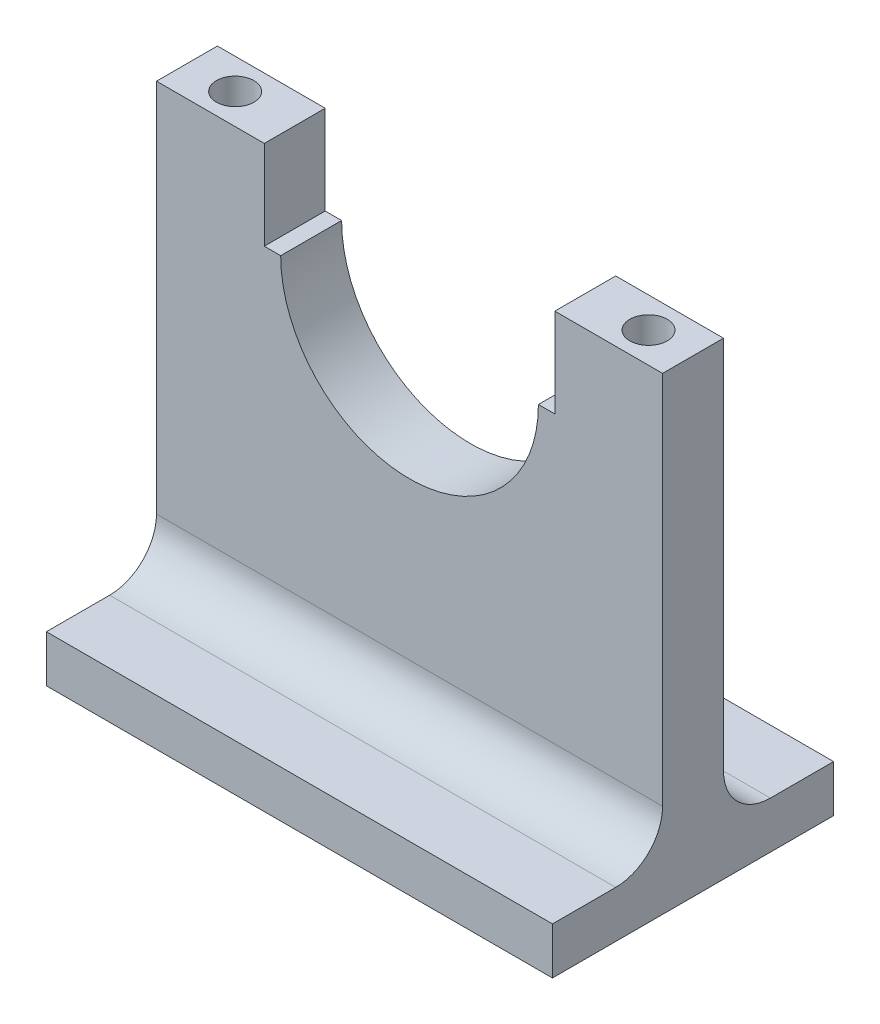
ISO-10303-21;
HEADER;
FILE_DESCRIPTION(('STEP AP214'),'2;1');
FILE_NAME('part.step','',(''),(''),'','','');
FILE_SCHEMA(('AUTOMOTIVE_DESIGN { 1 0 10303 214 1 1 1 1 }'));
ENDSEC;
DATA;
#1=APPLICATION_CONTEXT('core data for automotive mechanical design processes');
#2=APPLICATION_PROTOCOL_DEFINITION('international standard','automotive_design',2000,#1);
#3=PRODUCT_CONTEXT('',#1,'mechanical');
#4=PRODUCT('Part','Part','',(#3));
#5=PRODUCT_RELATED_PRODUCT_CATEGORY('part','',(#4));
#6=PRODUCT_DEFINITION_FORMATION('','',#4);
#7=PRODUCT_DEFINITION_CONTEXT('part definition',#1,'design');
#8=PRODUCT_DEFINITION('design','',#6,#7);
#9=PRODUCT_DEFINITION_SHAPE('','',#8);
#10=(LENGTH_UNIT() NAMED_UNIT(*) SI_UNIT(.MILLI.,.METRE.));
#11=(NAMED_UNIT(*) PLANE_ANGLE_UNIT() SI_UNIT($,.RADIAN.));
#12=(NAMED_UNIT(*) SI_UNIT($,.STERADIAN.) SOLID_ANGLE_UNIT());
#13=UNCERTAINTY_MEASURE_WITH_UNIT(LENGTH_MEASURE(1.E-05),#10,'distance_accuracy_value','');
#14=(GEOMETRIC_REPRESENTATION_CONTEXT(3) GLOBAL_UNCERTAINTY_ASSIGNED_CONTEXT((#13)) GLOBAL_UNIT_ASSIGNED_CONTEXT((#10,
#11,#12)) REPRESENTATION_CONTEXT('',''));
#15=CARTESIAN_POINT('',(0.,0.,0.));
#16=DIRECTION('',(0.,0.,1.));
#17=DIRECTION('',(1.,0.,0.));
#18=AXIS2_PLACEMENT_3D('',#15,#16,#17);
#19=CARTESIAN_POINT('',(-54.,5.,30.));
#20=DIRECTION('',(0.,-1.,0.));
#21=DIRECTION('',(0.,0.,-1.));
#22=AXIS2_PLACEMENT_3D('',#19,#20,#21);
#23=PLANE('',#22);
#24=DIRECTION('',(0.,0.,-1.));
#25=VECTOR('',#24,1.);
#26=CARTESIAN_POINT('',(54.,5.,30.));
#27=LINE('',#26,#25);
#28=CARTESIAN_POINT('',(54.,5.,30.));
#29=VERTEX_POINT('',#28);
#30=CARTESIAN_POINT('',(54.,5.,16.5));
#31=VERTEX_POINT('',#30);
#32=EDGE_CURVE('E258',#29,#31,#27,.T.);
#33=ORIENTED_EDGE('',*,*,#32,.T.);
#34=DIRECTION('',(1.,0.,0.));
#35=VECTOR('',#34,1.);
#36=CARTESIAN_POINT('',(-54.,5.,16.5));
#37=LINE('',#36,#35);
#38=CARTESIAN_POINT('',(-54.,5.,16.5));
#39=VERTEX_POINT('',#38);
#40=EDGE_CURVE('E262',#31,#39,#37,.F.);
#41=ORIENTED_EDGE('',*,*,#40,.T.);
#42=DIRECTION('',(0.,0.,-1.));
#43=VECTOR('',#42,1.);
#44=CARTESIAN_POINT('',(-54.,5.,30.));
#45=LINE('',#44,#43);
#46=CARTESIAN_POINT('',(-54.,5.,30.));
#47=VERTEX_POINT('',#46);
#48=EDGE_CURVE('E254',#47,#39,#45,.T.);
#49=ORIENTED_EDGE('',*,*,#48,.F.);
#50=DIRECTION('',(-1.,0.,0.));
#51=VECTOR('',#50,1.);
#52=CARTESIAN_POINT('',(-54.,5.,30.));
#53=LINE('',#52,#51);
#54=EDGE_CURVE('E233',#29,#47,#53,.T.);
#55=ORIENTED_EDGE('',*,*,#54,.F.);
#56=EDGE_LOOP('',(#33,#41,#49,#55));
#57=FACE_BOUND('',#56,.T.);
#58=ADVANCED_FACE('F41',(#57),#23,.F.);
#59=CARTESIAN_POINT('',(54.,-5.,30.));
#60=DIRECTION('',(-1.,0.,0.));
#61=DIRECTION('',(0.,0.,1.));
#62=AXIS2_PLACEMENT_3D('',#59,#60,#61);
#63=PLANE('',#62);
#64=DIRECTION('',(0.,1.,0.));
#65=VECTOR('',#64,1.);
#66=CARTESIAN_POINT('',(54.,-5.,-30.));
#67=LINE('',#66,#65);
#68=CARTESIAN_POINT('',(54.,-5.,-30.));
#69=VERTEX_POINT('',#68);
#70=CARTESIAN_POINT('',(54.,5.,-30.));
#71=VERTEX_POINT('',#70);
#72=EDGE_CURVE('E171',#69,#71,#67,.T.);
#73=ORIENTED_EDGE('',*,*,#72,.T.);
#74=CARTESIAN_POINT('',(54.,5.,-16.5));
#75=VERTEX_POINT('',#74);
#76=EDGE_CURVE('E257',#75,#71,#27,.T.);
#77=ORIENTED_EDGE('',*,*,#76,.F.);
#78=CARTESIAN_POINT('',(54.,15.,-16.5));
#79=DIRECTION('',(-1.,0.,0.));
#80=DIRECTION('',(0.,0.,1.));
#81=AXIS2_PLACEMENT_3D('',#78,#79,#80);
#82=CIRCLE('',#81,10.);
#83=CARTESIAN_POINT('',(54.,15.,-6.5));
#84=VERTEX_POINT('',#83);
#85=EDGE_CURVE('E49',#75,#84,#82,.T.);
#86=ORIENTED_EDGE('',*,*,#85,.T.);
#87=DIRECTION('',(0.,1.,0.));
#88=VECTOR('',#87,1.);
#89=CARTESIAN_POINT('',(54.,5.,-6.5));
#90=LINE('',#89,#88);
#91=CARTESIAN_POINT('',(54.,94.9999999999999,-6.5));
#92=VERTEX_POINT('',#91);
#93=EDGE_CURVE('E168',#84,#92,#90,.T.);
#94=ORIENTED_EDGE('',*,*,#93,.T.);
#95=DIRECTION('',(0.,0.,-1.));
#96=VECTOR('',#95,1.);
#97=CARTESIAN_POINT('',(54.,94.9999999999999,6.5));
#98=LINE('',#97,#96);
#99=CARTESIAN_POINT('',(54.,94.9999999999999,6.5));
#100=VERTEX_POINT('',#99);
#101=EDGE_CURVE('E165',#100,#92,#98,.T.);
#102=ORIENTED_EDGE('',*,*,#101,.F.);
#103=DIRECTION('',(0.,1.,0.));
#104=VECTOR('',#103,1.);
#105=CARTESIAN_POINT('',(54.,5.,6.5));
#106=LINE('',#105,#104);
#107=CARTESIAN_POINT('',(54.,15.,6.5));
#108=VERTEX_POINT('',#107);
#109=EDGE_CURVE('E153',#108,#100,#106,.T.);
#110=ORIENTED_EDGE('',*,*,#109,.F.);
#111=CARTESIAN_POINT('',(54.,15.,16.5));
#112=DIRECTION('',(-1.,0.,0.));
#113=DIRECTION('',(0.,0.,1.));
#114=AXIS2_PLACEMENT_3D('',#111,#112,#113);
#115=CIRCLE('',#114,10.);
#116=EDGE_CURVE('E268',#108,#31,#115,.T.);
#117=ORIENTED_EDGE('',*,*,#116,.T.);
#118=ORIENTED_EDGE('',*,*,#32,.F.);
#119=DIRECTION('',(0.,1.,0.));
#120=VECTOR('',#119,1.);
#121=CARTESIAN_POINT('',(54.,-5.,30.));
#122=LINE('',#121,#120);
#123=CARTESIAN_POINT('',(54.,-5.,30.));
#124=VERTEX_POINT('',#123);
#125=EDGE_CURVE('E230',#124,#29,#122,.T.);
#126=ORIENTED_EDGE('',*,*,#125,.F.);
#127=DIRECTION('',(0.,0.,-1.));
#128=VECTOR('',#127,1.);
#129=CARTESIAN_POINT('',(54.,-5.,30.));
#130=LINE('',#129,#128);
#131=EDGE_CURVE('E240',#124,#69,#130,.T.);
#132=ORIENTED_EDGE('',*,*,#131,.T.);
#133=EDGE_LOOP('',(#73,#77,#86,#94,#102,#110,#117,#118,#126,#132));
#134=FACE_BOUND('',#133,.T.);
#135=ADVANCED_FACE('F167',(#134),#63,.F.);
#136=CARTESIAN_POINT('',(-54.,5.,-16.5));
#137=VERTEX_POINT('',#136);
#138=CARTESIAN_POINT('',(-54.,5.,-30.));
#139=VERTEX_POINT('',#138);
#140=EDGE_CURVE('E253',#137,#139,#45,.T.);
#141=ORIENTED_EDGE('',*,*,#140,.F.);
#142=DIRECTION('',(1.,0.,0.));
#143=VECTOR('',#142,1.);
#144=CARTESIAN_POINT('',(54.,5.,-16.5));
#145=LINE('',#144,#143);
#146=EDGE_CURVE('E264',#137,#75,#145,.T.);
#147=ORIENTED_EDGE('',*,*,#146,.T.);
#148=ORIENTED_EDGE('',*,*,#76,.T.);
#149=DIRECTION('',(-1.,0.,0.));
#150=VECTOR('',#149,1.);
#151=CARTESIAN_POINT('',(-54.,5.,-30.));
#152=LINE('',#151,#150);
#153=EDGE_CURVE('E242',#71,#139,#152,.T.);
#154=ORIENTED_EDGE('',*,*,#153,.T.);
#155=EDGE_LOOP('',(#141,#147,#148,#154));
#156=FACE_BOUND('',#155,.T.);
#157=ADVANCED_FACE('F298',(#156),#23,.F.);
#158=CARTESIAN_POINT('',(-54.,-5.,30.));
#159=DIRECTION('',(1.,0.,0.));
#160=DIRECTION('',(0.,0.,-1.));
#161=AXIS2_PLACEMENT_3D('',#158,#159,#160);
#162=PLANE('',#161);
#163=DIRECTION('',(0.,-1.,0.));
#164=VECTOR('',#163,1.);
#165=CARTESIAN_POINT('',(-54.,-5.,-30.));
#166=LINE('',#165,#164);
#167=CARTESIAN_POINT('',(-54.,-5.,-30.));
#168=VERTEX_POINT('',#167);
#169=EDGE_CURVE('E245',#139,#168,#166,.T.);
#170=ORIENTED_EDGE('',*,*,#169,.T.);
#171=DIRECTION('',(0.,0.,-1.));
#172=VECTOR('',#171,1.);
#173=CARTESIAN_POINT('',(-54.,-5.,30.));
#174=LINE('',#173,#172);
#175=CARTESIAN_POINT('',(-54.,-5.,30.));
#176=VERTEX_POINT('',#175);
#177=EDGE_CURVE('E250',#176,#168,#174,.T.);
#178=ORIENTED_EDGE('',*,*,#177,.F.);
#179=DIRECTION('',(0.,-1.,0.));
#180=VECTOR('',#179,1.);
#181=CARTESIAN_POINT('',(-54.,-5.,30.));
#182=LINE('',#181,#180);
#183=EDGE_CURVE('E236',#47,#176,#182,.T.);
#184=ORIENTED_EDGE('',*,*,#183,.F.);
#185=ORIENTED_EDGE('',*,*,#48,.T.);
#186=CARTESIAN_POINT('',(-54.,15.,16.5));
#187=DIRECTION('',(1.,0.,0.));
#188=DIRECTION('',(0.,0.,-1.));
#189=AXIS2_PLACEMENT_3D('',#186,#187,#188);
#190=CIRCLE('',#189,10.);
#191=CARTESIAN_POINT('',(-54.,15.,6.5));
#192=VERTEX_POINT('',#191);
#193=EDGE_CURVE('E270',#39,#192,#190,.T.);
#194=ORIENTED_EDGE('',*,*,#193,.T.);
#195=DIRECTION('',(0.,-1.,0.));
#196=VECTOR('',#195,1.);
#197=CARTESIAN_POINT('',(-54.,5.,6.5));
#198=LINE('',#197,#196);
#199=CARTESIAN_POINT('',(-54.,95.,6.5));
#200=VERTEX_POINT('',#199);
#201=EDGE_CURVE('E192',#200,#192,#198,.T.);
#202=ORIENTED_EDGE('',*,*,#201,.F.);
#203=DIRECTION('',(0.,0.,-1.));
#204=VECTOR('',#203,1.);
#205=CARTESIAN_POINT('',(-54.,95.,6.5));
#206=LINE('',#205,#204);
#207=CARTESIAN_POINT('',(-54.,95.,-6.5));
#208=VERTEX_POINT('',#207);
#209=EDGE_CURVE('E194',#200,#208,#206,.T.);
#210=ORIENTED_EDGE('',*,*,#209,.T.);
#211=DIRECTION('',(0.,-1.,0.));
#212=VECTOR('',#211,1.);
#213=CARTESIAN_POINT('',(-54.,5.,-6.5));
#214=LINE('',#213,#212);
#215=CARTESIAN_POINT('',(-54.,15.,-6.5));
#216=VERTEX_POINT('',#215);
#217=EDGE_CURVE('E162',#208,#216,#214,.T.);
#218=ORIENTED_EDGE('',*,*,#217,.T.);
#219=CARTESIAN_POINT('',(-54.,15.,-16.5));
#220=DIRECTION('',(1.,0.,0.));
#221=DIRECTION('',(0.,0.,-1.));
#222=AXIS2_PLACEMENT_3D('',#219,#220,#221);
#223=CIRCLE('',#222,10.);
#224=EDGE_CURVE('E11',#216,#137,#223,.T.);
#225=ORIENTED_EDGE('',*,*,#224,.T.);
#226=ORIENTED_EDGE('',*,*,#140,.T.);
#227=EDGE_LOOP('',(#170,#178,#184,#185,#194,#202,#210,#218,#225,#226));
#228=FACE_BOUND('',#227,.T.);
#229=ADVANCED_FACE('F274',(#228),#162,.F.);
#230=CARTESIAN_POINT('',(-54.,-5.,30.));
#231=DIRECTION('',(0.,1.,0.));
#232=DIRECTION('',(0.,0.,1.));
#233=AXIS2_PLACEMENT_3D('',#230,#231,#232);
#234=PLANE('',#233);
#235=DIRECTION('',(1.,0.,0.));
#236=VECTOR('',#235,1.);
#237=CARTESIAN_POINT('',(-54.,-5.,-30.));
#238=LINE('',#237,#236);
#239=EDGE_CURVE('E234',#168,#69,#238,.T.);
#240=ORIENTED_EDGE('',*,*,#239,.T.);
#241=ORIENTED_EDGE('',*,*,#131,.F.);
#242=DIRECTION('',(1.,0.,0.));
#243=VECTOR('',#242,1.);
#244=CARTESIAN_POINT('',(-54.,-5.,30.));
#245=LINE('',#244,#243);
#246=EDGE_CURVE('E238',#176,#124,#245,.T.);
#247=ORIENTED_EDGE('',*,*,#246,.F.);
#248=ORIENTED_EDGE('',*,*,#177,.T.);
#249=EDGE_LOOP('',(#240,#241,#247,#248));
#250=FACE_BOUND('',#249,.T.);
#251=ADVANCED_FACE('F350',(#250),#234,.F.);
#252=CARTESIAN_POINT('',(0.,0.,30.));
#253=DIRECTION('',(0.,0.,-1.));
#254=DIRECTION('',(-1.,0.,0.));
#255=AXIS2_PLACEMENT_3D('',#252,#253,#254);
#256=PLANE('',#255);
#257=ORIENTED_EDGE('',*,*,#125,.T.);
#258=ORIENTED_EDGE('',*,*,#54,.T.);
#259=ORIENTED_EDGE('',*,*,#183,.T.);
#260=ORIENTED_EDGE('',*,*,#246,.T.);
#261=EDGE_LOOP('',(#257,#258,#259,#260));
#262=FACE_BOUND('',#261,.T.);
#263=ADVANCED_FACE('F286',(#262),#256,.F.);
#264=CARTESIAN_POINT('',(0.,0.,-30.));
#265=DIRECTION('',(0.,0.,-1.));
#266=DIRECTION('',(-1.,0.,0.));
#267=AXIS2_PLACEMENT_3D('',#264,#265,#266);
#268=PLANE('',#267);
#269=ORIENTED_EDGE('',*,*,#72,.F.);
#270=ORIENTED_EDGE('',*,*,#239,.F.);
#271=ORIENTED_EDGE('',*,*,#169,.F.);
#272=ORIENTED_EDGE('',*,*,#153,.F.);
#273=EDGE_LOOP('',(#269,#270,#271,#272));
#274=FACE_BOUND('',#273,.T.);
#275=ADVANCED_FACE('F294',(#274),#268,.T.);
#276=CARTESIAN_POINT('',(54.,94.9999999999999,6.5));
#277=DIRECTION('',(0.,-1.,0.));
#278=DIRECTION('',(1.,0.,0.));
#279=AXIS2_PLACEMENT_3D('',#276,#277,#278);
#280=PLANE('',#279);
#281=CARTESIAN_POINT('',(44.5,94.9999999999999,0.));
#282=DIRECTION('',(0.,1.,0.));
#283=DIRECTION('',(-1.,0.,0.));
#284=AXIS2_PLACEMENT_3D('',#281,#282,#283);
#285=CIRCLE('',#284,4.00000000000001);
#286=CARTESIAN_POINT('',(40.5,94.9999999999999,0.));
#287=VERTEX_POINT('',#286);
#288=EDGE_CURVE('E566',#287,#287,#285,.T.);
#289=ORIENTED_EDGE('',*,*,#288,.F.);
#290=EDGE_LOOP('',(#289));
#291=FACE_BOUND('',#290,.T.);
#292=DIRECTION('',(-1.,0.,0.));
#293=VECTOR('',#292,1.);
#294=CARTESIAN_POINT('',(54.,94.9999999999999,-6.5));
#295=LINE('',#294,#293);
#296=CARTESIAN_POINT('',(31.,94.9999999999999,-6.5));
#297=VERTEX_POINT('',#296);
#298=EDGE_CURVE('E196',#92,#297,#295,.T.);
#299=ORIENTED_EDGE('',*,*,#298,.T.);
#300=DIRECTION('',(0.,0.,-1.));
#301=VECTOR('',#300,1.);
#302=CARTESIAN_POINT('',(31.,94.9999999999999,6.5));
#303=LINE('',#302,#301);
#304=CARTESIAN_POINT('',(31.,94.9999999999999,6.5));
#305=VERTEX_POINT('',#304);
#306=EDGE_CURVE('E172',#305,#297,#303,.T.);
#307=ORIENTED_EDGE('',*,*,#306,.F.);
#308=DIRECTION('',(-1.,0.,0.));
#309=VECTOR('',#308,1.);
#310=CARTESIAN_POINT('',(54.,94.9999999999999,6.5));
#311=LINE('',#310,#309);
#312=EDGE_CURVE('E158',#100,#305,#311,.T.);
#313=ORIENTED_EDGE('',*,*,#312,.F.);
#314=ORIENTED_EDGE('',*,*,#101,.T.);
#315=EDGE_LOOP('',(#299,#307,#313,#314));
#316=FACE_BOUND('',#315,.T.);
#317=ADVANCED_FACE('F174',(#291,#316),#280,.F.);
#318=CARTESIAN_POINT('',(31.,94.9999999999999,6.5));
#319=DIRECTION('',(1.,0.,0.));
#320=DIRECTION('',(0.,0.,-1.));
#321=AXIS2_PLACEMENT_3D('',#318,#319,#320);
#322=PLANE('',#321);
#323=DIRECTION('',(0.,-1.,0.));
#324=VECTOR('',#323,1.);
#325=CARTESIAN_POINT('',(31.,94.9999999999999,-6.5));
#326=LINE('',#325,#324);
#327=CARTESIAN_POINT('',(31.,75.9999999999999,-6.5));
#328=VERTEX_POINT('',#327);
#329=EDGE_CURVE('E199',#297,#328,#326,.T.);
#330=ORIENTED_EDGE('',*,*,#329,.T.);
#331=DIRECTION('',(0.,0.,-1.));
#332=VECTOR('',#331,1.);
#333=CARTESIAN_POINT('',(31.,75.9999999999999,6.5));
#334=LINE('',#333,#332);
#335=CARTESIAN_POINT('',(31.,75.9999999999999,6.5));
#336=VERTEX_POINT('',#335);
#337=EDGE_CURVE('E226',#336,#328,#334,.T.);
#338=ORIENTED_EDGE('',*,*,#337,.F.);
#339=DIRECTION('',(0.,-1.,0.));
#340=VECTOR('',#339,1.);
#341=CARTESIAN_POINT('',(31.,94.9999999999999,6.5));
#342=LINE('',#341,#340);
#343=EDGE_CURVE('E177',#305,#336,#342,.T.);
#344=ORIENTED_EDGE('',*,*,#343,.F.);
#345=ORIENTED_EDGE('',*,*,#306,.T.);
#346=EDGE_LOOP('',(#330,#338,#344,#345));
#347=FACE_BOUND('',#346,.T.);
#348=ADVANCED_FACE('F329',(#347),#322,.F.);
#349=CARTESIAN_POINT('',(31.,75.9999999999999,6.5));
#350=DIRECTION('',(0.,-1.,0.));
#351=DIRECTION('',(0.,0.,-1.));
#352=AXIS2_PLACEMENT_3D('',#349,#350,#351);
#353=PLANE('',#352);
#354=DIRECTION('',(-1.,0.,0.));
#355=VECTOR('',#354,1.);
#356=CARTESIAN_POINT('',(31.,75.9999999999999,-6.5));
#357=LINE('',#356,#355);
#358=CARTESIAN_POINT('',(27.5,76.,-6.5));
#359=VERTEX_POINT('',#358);
#360=EDGE_CURVE('E201',#328,#359,#357,.T.);
#361=ORIENTED_EDGE('',*,*,#360,.T.);
#362=DIRECTION('',(0.,0.,-1.));
#363=VECTOR('',#362,1.);
#364=CARTESIAN_POINT('',(27.5,76.,6.5));
#365=LINE('',#364,#363);
#366=CARTESIAN_POINT('',(27.5,76.,6.5));
#367=VERTEX_POINT('',#366);
#368=EDGE_CURVE('E223',#367,#359,#365,.T.);
#369=ORIENTED_EDGE('',*,*,#368,.F.);
#370=DIRECTION('',(-1.,0.,0.));
#371=VECTOR('',#370,1.);
#372=CARTESIAN_POINT('',(31.,75.9999999999999,6.5));
#373=LINE('',#372,#371);
#374=EDGE_CURVE('E179',#336,#367,#373,.T.);
#375=ORIENTED_EDGE('',*,*,#374,.F.);
#376=ORIENTED_EDGE('',*,*,#337,.T.);
#377=EDGE_LOOP('',(#361,#369,#375,#376));
#378=FACE_BOUND('',#377,.T.);
#379=ADVANCED_FACE('F326',(#378),#353,.F.);
#380=CARTESIAN_POINT('',(0.,76.,6.5));
#381=DIRECTION('',(0.,0.,-1.));
#382=DIRECTION('',(-1.,0.,0.));
#383=AXIS2_PLACEMENT_3D('',#380,#381,#382);
#384=CYLINDRICAL_SURFACE('',#383,27.5);
#385=CARTESIAN_POINT('',(0.,76.,-6.5));
#386=DIRECTION('',(0.,0.,-1.));
#387=DIRECTION('',(1.,0.,0.));
#388=AXIS2_PLACEMENT_3D('',#385,#386,#387);
#389=CIRCLE('',#388,27.5);
#390=CARTESIAN_POINT('',(-27.5,76.,-6.5));
#391=VERTEX_POINT('',#390);
#392=EDGE_CURVE('E203',#359,#391,#389,.T.);
#393=ORIENTED_EDGE('',*,*,#392,.T.);
#394=DIRECTION('',(0.,0.,-1.));
#395=VECTOR('',#394,1.);
#396=CARTESIAN_POINT('',(-27.5,76.,6.5));
#397=LINE('',#396,#395);
#398=CARTESIAN_POINT('',(-27.5,76.,6.5));
#399=VERTEX_POINT('',#398);
#400=EDGE_CURVE('E220',#399,#391,#397,.T.);
#401=ORIENTED_EDGE('',*,*,#400,.F.);
#402=CARTESIAN_POINT('',(0.,76.,6.5));
#403=DIRECTION('',(0.,0.,-1.));
#404=DIRECTION('',(1.,0.,0.));
#405=AXIS2_PLACEMENT_3D('',#402,#403,#404);
#406=CIRCLE('',#405,27.5);
#407=EDGE_CURVE('E184',#367,#399,#406,.T.);
#408=ORIENTED_EDGE('',*,*,#407,.F.);
#409=ORIENTED_EDGE('',*,*,#368,.T.);
#410=EDGE_LOOP('',(#393,#401,#408,#409));
#411=FACE_BOUND('',#410,.T.);
#412=ADVANCED_FACE('F321',(#411),#384,.F.);
#413=CARTESIAN_POINT('',(-31.,76.,6.5));
#414=DIRECTION('',(0.,-1.,0.));
#415=DIRECTION('',(0.,0.,-1.));
#416=AXIS2_PLACEMENT_3D('',#413,#414,#415);
#417=PLANE('',#416);
#418=DIRECTION('',(-1.,0.,0.));
#419=VECTOR('',#418,1.);
#420=CARTESIAN_POINT('',(-31.,76.,-6.5));
#421=LINE('',#420,#419);
#422=CARTESIAN_POINT('',(-31.,76.,-6.5));
#423=VERTEX_POINT('',#422);
#424=EDGE_CURVE('E205',#391,#423,#421,.T.);
#425=ORIENTED_EDGE('',*,*,#424,.T.);
#426=DIRECTION('',(0.,0.,-1.));
#427=VECTOR('',#426,1.);
#428=CARTESIAN_POINT('',(-31.,76.,6.5));
#429=LINE('',#428,#427);
#430=CARTESIAN_POINT('',(-31.,76.,6.5));
#431=VERTEX_POINT('',#430);
#432=EDGE_CURVE('E217',#431,#423,#429,.T.);
#433=ORIENTED_EDGE('',*,*,#432,.F.);
#434=DIRECTION('',(-1.,0.,0.));
#435=VECTOR('',#434,1.);
#436=CARTESIAN_POINT('',(-31.,76.,6.5));
#437=LINE('',#436,#435);
#438=EDGE_CURVE('E186',#399,#431,#437,.T.);
#439=ORIENTED_EDGE('',*,*,#438,.F.);
#440=ORIENTED_EDGE('',*,*,#400,.T.);
#441=EDGE_LOOP('',(#425,#433,#439,#440));
#442=FACE_BOUND('',#441,.T.);
#443=ADVANCED_FACE('F315',(#442),#417,.F.);
#444=CARTESIAN_POINT('',(-31.,95.,6.5));
#445=DIRECTION('',(-1.,0.,0.));
#446=DIRECTION('',(0.,-1.,0.));
#447=AXIS2_PLACEMENT_3D('',#444,#445,#446);
#448=PLANE('',#447);
#449=DIRECTION('',(0.,1.,0.));
#450=VECTOR('',#449,1.);
#451=CARTESIAN_POINT('',(-31.,95.,-6.5));
#452=LINE('',#451,#450);
#453=CARTESIAN_POINT('',(-31.,95.,-6.5));
#454=VERTEX_POINT('',#453);
#455=EDGE_CURVE('E207',#423,#454,#452,.T.);
#456=ORIENTED_EDGE('',*,*,#455,.T.);
#457=DIRECTION('',(0.,0.,-1.));
#458=VECTOR('',#457,1.);
#459=CARTESIAN_POINT('',(-31.,95.,6.5));
#460=LINE('',#459,#458);
#461=CARTESIAN_POINT('',(-31.,95.,6.5));
#462=VERTEX_POINT('',#461);
#463=EDGE_CURVE('E214',#462,#454,#460,.T.);
#464=ORIENTED_EDGE('',*,*,#463,.F.);
#465=DIRECTION('',(0.,1.,0.));
#466=VECTOR('',#465,1.);
#467=CARTESIAN_POINT('',(-31.,95.,6.5));
#468=LINE('',#467,#466);
#469=EDGE_CURVE('E188',#431,#462,#468,.T.);
#470=ORIENTED_EDGE('',*,*,#469,.F.);
#471=ORIENTED_EDGE('',*,*,#432,.T.);
#472=EDGE_LOOP('',(#456,#464,#470,#471));
#473=FACE_BOUND('',#472,.T.);
#474=ADVANCED_FACE('F311',(#473),#448,.F.);
#475=CARTESIAN_POINT('',(-54.,95.,6.5));
#476=DIRECTION('',(0.,-1.,0.));
#477=DIRECTION('',(0.,0.,-1.));
#478=AXIS2_PLACEMENT_3D('',#475,#476,#477);
#479=PLANE('',#478);
#480=CARTESIAN_POINT('',(-43.7154540960771,94.9999999999999,0.));
#481=DIRECTION('',(0.,1.,0.));
#482=DIRECTION('',(1.,0.,0.));
#483=AXIS2_PLACEMENT_3D('',#480,#481,#482);
#484=CIRCLE('',#483,4.00000000000001);
#485=CARTESIAN_POINT('',(-39.7154540960771,94.9999999999999,0.));
#486=VERTEX_POINT('',#485);
#487=EDGE_CURVE('E569',#486,#486,#484,.T.);
#488=ORIENTED_EDGE('',*,*,#487,.F.);
#489=EDGE_LOOP('',(#488));
#490=FACE_BOUND('',#489,.T.);
#491=DIRECTION('',(-1.,0.,0.));
#492=VECTOR('',#491,1.);
#493=CARTESIAN_POINT('',(-54.,95.,-6.5));
#494=LINE('',#493,#492);
#495=EDGE_CURVE('E209',#454,#208,#494,.T.);
#496=ORIENTED_EDGE('',*,*,#495,.T.);
#497=ORIENTED_EDGE('',*,*,#209,.F.);
#498=DIRECTION('',(-1.,0.,0.));
#499=VECTOR('',#498,1.);
#500=CARTESIAN_POINT('',(-54.,95.,6.5));
#501=LINE('',#500,#499);
#502=EDGE_CURVE('E190',#462,#200,#501,.T.);
#503=ORIENTED_EDGE('',*,*,#502,.F.);
#504=ORIENTED_EDGE('',*,*,#463,.T.);
#505=EDGE_LOOP('',(#496,#497,#503,#504));
#506=FACE_BOUND('',#505,.T.);
#507=ADVANCED_FACE('F307',(#490,#506),#479,.F.);
#508=CARTESIAN_POINT('',(0.,76.,6.5));
#509=DIRECTION('',(0.,0.,1.));
#510=DIRECTION('',(1.,0.,0.));
#511=AXIS2_PLACEMENT_3D('',#508,#509,#510);
#512=PLANE('',#511);
#513=ORIENTED_EDGE('',*,*,#201,.T.);
#514=DIRECTION('',(1.,0.,0.));
#515=VECTOR('',#514,1.);
#516=CARTESIAN_POINT('',(0.,15.,6.5));
#517=LINE('',#516,#515);
#518=EDGE_CURVE('E161',#192,#108,#517,.T.);
#519=ORIENTED_EDGE('',*,*,#518,.T.);
#520=ORIENTED_EDGE('',*,*,#109,.T.);
#521=ORIENTED_EDGE('',*,*,#312,.T.);
#522=ORIENTED_EDGE('',*,*,#343,.T.);
#523=ORIENTED_EDGE('',*,*,#374,.T.);
#524=ORIENTED_EDGE('',*,*,#407,.T.);
#525=ORIENTED_EDGE('',*,*,#438,.T.);
#526=ORIENTED_EDGE('',*,*,#469,.T.);
#527=ORIENTED_EDGE('',*,*,#502,.T.);
#528=EDGE_LOOP('',(#513,#519,#520,#521,#522,#523,#524,#525,#526,#527));
#529=FACE_BOUND('',#528,.T.);
#530=ADVANCED_FACE('F156',(#529),#512,.T.);
#531=CARTESIAN_POINT('',(0.,76.,-6.5));
#532=DIRECTION('',(0.,0.,1.));
#533=DIRECTION('',(1.,0.,0.));
#534=AXIS2_PLACEMENT_3D('',#531,#532,#533);
#535=PLANE('',#534);
#536=ORIENTED_EDGE('',*,*,#93,.F.);
#537=DIRECTION('',(1.,0.,0.));
#538=VECTOR('',#537,1.);
#539=CARTESIAN_POINT('',(-54.,15.,-6.5));
#540=LINE('',#539,#538);
#541=EDGE_CURVE('E62',#84,#216,#540,.F.);
#542=ORIENTED_EDGE('',*,*,#541,.T.);
#543=ORIENTED_EDGE('',*,*,#217,.F.);
#544=ORIENTED_EDGE('',*,*,#495,.F.);
#545=ORIENTED_EDGE('',*,*,#455,.F.);
#546=ORIENTED_EDGE('',*,*,#424,.F.);
#547=ORIENTED_EDGE('',*,*,#392,.F.);
#548=ORIENTED_EDGE('',*,*,#360,.F.);
#549=ORIENTED_EDGE('',*,*,#329,.F.);
#550=ORIENTED_EDGE('',*,*,#298,.F.);
#551=EDGE_LOOP('',(#536,#542,#543,#544,#545,#546,#547,#548,#549,#550));
#552=FACE_BOUND('',#551,.T.);
#553=ADVANCED_FACE('F303',(#552),#535,.F.);
#554=CARTESIAN_POINT('',(-43.7154540960771,72.9999999999999,0.));
#555=DIRECTION('',(0.,1.,0.));
#556=DIRECTION('',(-1.,0.,0.));
#557=AXIS2_PLACEMENT_3D('',#554,#555,#556);
#558=CYLINDRICAL_SURFACE('',#557,4.00000000000001);
#559=CARTESIAN_POINT('',(-43.7154540960771,72.9999999999999,0.));
#560=DIRECTION('',(0.,1.,0.));
#561=DIRECTION('',(1.,0.,0.));
#562=AXIS2_PLACEMENT_3D('',#559,#560,#561);
#563=CIRCLE('',#562,4.00000000000001);
#564=CARTESIAN_POINT('',(-39.7154540960771,72.9999999999999,0.));
#565=VERTEX_POINT('',#564);
#566=EDGE_CURVE('E573',#565,#565,#563,.T.);
#567=ORIENTED_EDGE('',*,*,#566,.F.);
#568=EDGE_LOOP('',(#567));
#569=FACE_BOUND('',#568,.T.);
#570=ORIENTED_EDGE('',*,*,#487,.T.);
#571=EDGE_LOOP('',(#570));
#572=FACE_BOUND('',#571,.T.);
#573=ADVANCED_FACE('F396',(#569,#572),#558,.F.);
#574=CARTESIAN_POINT('',(-43.7154540960771,72.9999999999999,0.));
#575=DIRECTION('',(0.,-1.,0.));
#576=DIRECTION('',(1.,0.,0.));
#577=AXIS2_PLACEMENT_3D('',#574,#575,#576);
#578=PLANE('',#577);
#579=ORIENTED_EDGE('',*,*,#566,.T.);
#580=EDGE_LOOP('',(#579));
#581=FACE_BOUND('',#580,.T.);
#582=ADVANCED_FACE('F401',(#581),#578,.F.);
#583=CARTESIAN_POINT('',(44.5,73.,0.));
#584=DIRECTION('',(0.,1.,0.));
#585=DIRECTION('',(-1.,0.,0.));
#586=AXIS2_PLACEMENT_3D('',#583,#584,#585);
#587=CYLINDRICAL_SURFACE('',#586,4.00000000000001);
#588=CARTESIAN_POINT('',(44.5,73.,0.));
#589=DIRECTION('',(0.,1.,0.));
#590=DIRECTION('',(-1.,0.,0.));
#591=AXIS2_PLACEMENT_3D('',#588,#589,#590);
#592=CIRCLE('',#591,4.00000000000001);
#593=CARTESIAN_POINT('',(40.5,73.,0.));
#594=VERTEX_POINT('',#593);
#595=EDGE_CURVE('E197',#594,#594,#592,.T.);
#596=ORIENTED_EDGE('',*,*,#595,.F.);
#597=EDGE_LOOP('',(#596));
#598=FACE_BOUND('',#597,.T.);
#599=ORIENTED_EDGE('',*,*,#288,.T.);
#600=EDGE_LOOP('',(#599));
#601=FACE_BOUND('',#600,.T.);
#602=ADVANCED_FACE('F414',(#598,#601),#587,.F.);
#603=CARTESIAN_POINT('',(44.5,73.,0.));
#604=DIRECTION('',(0.,1.,0.));
#605=DIRECTION('',(-1.,0.,0.));
#606=AXIS2_PLACEMENT_3D('',#603,#604,#605);
#607=PLANE('',#606);
#608=ORIENTED_EDGE('',*,*,#595,.T.);
#609=EDGE_LOOP('',(#608));
#610=FACE_BOUND('',#609,.T.);
#611=ADVANCED_FACE('F425',(#610),#607,.T.);
#612=CARTESIAN_POINT('',(0.,15.,16.5));
#613=DIRECTION('',(1.,0.,0.));
#614=DIRECTION('',(0.,0.,-1.));
#615=AXIS2_PLACEMENT_3D('',#612,#613,#614);
#616=CYLINDRICAL_SURFACE('',#615,10.);
#617=ORIENTED_EDGE('',*,*,#193,.F.);
#618=ORIENTED_EDGE('',*,*,#40,.F.);
#619=ORIENTED_EDGE('',*,*,#116,.F.);
#620=ORIENTED_EDGE('',*,*,#518,.F.);
#621=EDGE_LOOP('',(#617,#618,#619,#620));
#622=FACE_BOUND('',#621,.T.);
#623=ADVANCED_FACE('F281',(#622),#616,.F.);
#624=CARTESIAN_POINT('',(-54.,15.,-16.5));
#625=DIRECTION('',(-1.,0.,0.));
#626=DIRECTION('',(0.,0.,1.));
#627=AXIS2_PLACEMENT_3D('',#624,#625,#626);
#628=CYLINDRICAL_SURFACE('',#627,10.);
#629=ORIENTED_EDGE('',*,*,#224,.F.);
#630=ORIENTED_EDGE('',*,*,#541,.F.);
#631=ORIENTED_EDGE('',*,*,#85,.F.);
#632=ORIENTED_EDGE('',*,*,#146,.F.);
#633=EDGE_LOOP('',(#629,#630,#631,#632));
#634=FACE_BOUND('',#633,.T.);
#635=ADVANCED_FACE('F43',(#634),#628,.F.);
#636=CLOSED_SHELL('',(#58,#135,#157,#229,#251,#263,#275,#317,#348,#379,#412,#443,#474,#507,#530,
#553,#573,#582,#602,#611,#623,#635));
#637=MANIFOLD_SOLID_BREP('B2',#636);
#638=ADVANCED_BREP_SHAPE_REPRESENTATION('',(#18,#637),#14);
#639=SHAPE_DEFINITION_REPRESENTATION(#9,#638);
ENDSEC;
END-ISO-10303-21;
